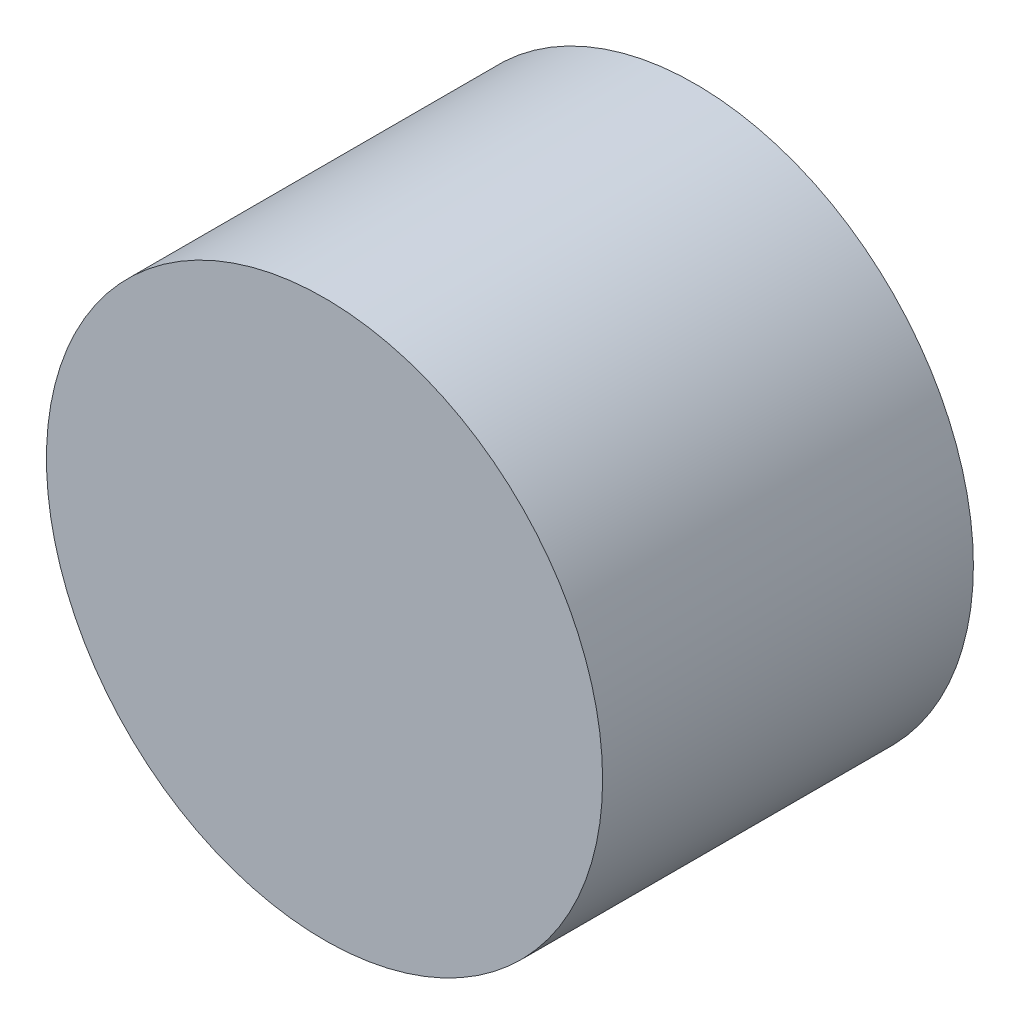
ISO-10303-21;
HEADER;
FILE_DESCRIPTION(('STEP AP214'),'2;1');
FILE_NAME('part.step','',(''),(''),'','','');
FILE_SCHEMA(('AUTOMOTIVE_DESIGN { 1 0 10303 214 1 1 1 1 }'));
ENDSEC;
DATA;
#1=APPLICATION_CONTEXT('core data for automotive mechanical design processes');
#2=APPLICATION_PROTOCOL_DEFINITION('international standard','automotive_design',2000,#1);
#3=PRODUCT_CONTEXT('',#1,'mechanical');
#4=PRODUCT('Part','Part','',(#3));
#5=PRODUCT_RELATED_PRODUCT_CATEGORY('part','',(#4));
#6=PRODUCT_DEFINITION_FORMATION('','',#4);
#7=PRODUCT_DEFINITION_CONTEXT('part definition',#1,'design');
#8=PRODUCT_DEFINITION('design','',#6,#7);
#9=PRODUCT_DEFINITION_SHAPE('','',#8);
#10=(LENGTH_UNIT() NAMED_UNIT(*) SI_UNIT(.MILLI.,.METRE.));
#11=(NAMED_UNIT(*) PLANE_ANGLE_UNIT() SI_UNIT($,.RADIAN.));
#12=(NAMED_UNIT(*) SI_UNIT($,.STERADIAN.) SOLID_ANGLE_UNIT());
#13=UNCERTAINTY_MEASURE_WITH_UNIT(LENGTH_MEASURE(1.E-05),#10,'distance_accuracy_value','');
#14=(GEOMETRIC_REPRESENTATION_CONTEXT(3) GLOBAL_UNCERTAINTY_ASSIGNED_CONTEXT((#13)) GLOBAL_UNIT_ASSIGNED_CONTEXT((#10,
#11,#12)) REPRESENTATION_CONTEXT('',''));
#15=CARTESIAN_POINT('',(0.,0.,0.));
#16=DIRECTION('',(0.,0.,1.));
#17=DIRECTION('',(1.,0.,0.));
#18=AXIS2_PLACEMENT_3D('',#15,#16,#17);
#19=CARTESIAN_POINT('',(0.,0.,40.));
#20=DIRECTION('',(0.,0.,-1.));
#21=DIRECTION('',(-1.,0.,0.));
#22=AXIS2_PLACEMENT_3D('',#19,#20,#21);
#23=CYLINDRICAL_SURFACE('',#22,30.);
#24=CARTESIAN_POINT('',(0.,0.,40.));
#25=DIRECTION('',(0.,0.,1.));
#26=DIRECTION('',(1.,0.,0.));
#27=AXIS2_PLACEMENT_3D('',#24,#25,#26);
#28=CIRCLE('',#27,30.);
#29=CARTESIAN_POINT('',(30.,0.,40.));
#30=VERTEX_POINT('',#29);
#31=EDGE_CURVE('E10',#30,#30,#28,.T.);
#32=ORIENTED_EDGE('',*,*,#31,.F.);
#33=EDGE_LOOP('',(#32));
#34=FACE_BOUND('',#33,.T.);
#35=CARTESIAN_POINT('',(0.,0.,0.));
#36=DIRECTION('',(0.,0.,1.));
#37=DIRECTION('',(1.,0.,0.));
#38=AXIS2_PLACEMENT_3D('',#35,#36,#37);
#39=CIRCLE('',#38,30.);
#40=CARTESIAN_POINT('',(30.,0.,0.));
#41=VERTEX_POINT('',#40);
#42=EDGE_CURVE('E38',#41,#41,#39,.T.);
#43=ORIENTED_EDGE('',*,*,#42,.T.);
#44=EDGE_LOOP('',(#43));
#45=FACE_BOUND('',#44,.T.);
#46=ADVANCED_FACE('F35',(#34,#45),#23,.T.);
#47=CARTESIAN_POINT('',(0.,0.,40.));
#48=DIRECTION('',(0.,0.,1.));
#49=DIRECTION('',(1.,0.,0.));
#50=AXIS2_PLACEMENT_3D('',#47,#48,#49);
#51=PLANE('',#50);
#52=ORIENTED_EDGE('',*,*,#31,.T.);
#53=EDGE_LOOP('',(#52));
#54=FACE_BOUND('',#53,.T.);
#55=ADVANCED_FACE('F50',(#54),#51,.T.);
#56=CARTESIAN_POINT('',(0.,0.,0.));
#57=DIRECTION('',(0.,0.,1.));
#58=DIRECTION('',(1.,0.,0.));
#59=AXIS2_PLACEMENT_3D('',#56,#57,#58);
#60=PLANE('',#59);
#61=ORIENTED_EDGE('',*,*,#42,.F.);
#62=EDGE_LOOP('',(#61));
#63=FACE_BOUND('',#62,.T.);
#64=ADVANCED_FACE('F48',(#63),#60,.F.);
#65=CLOSED_SHELL('',(#46,#55,#64));
#66=MANIFOLD_SOLID_BREP('B2',#65);
#67=ADVANCED_BREP_SHAPE_REPRESENTATION('',(#18,#66),#14);
#68=SHAPE_DEFINITION_REPRESENTATION(#9,#67);
ENDSEC;
END-ISO-10303-21;
